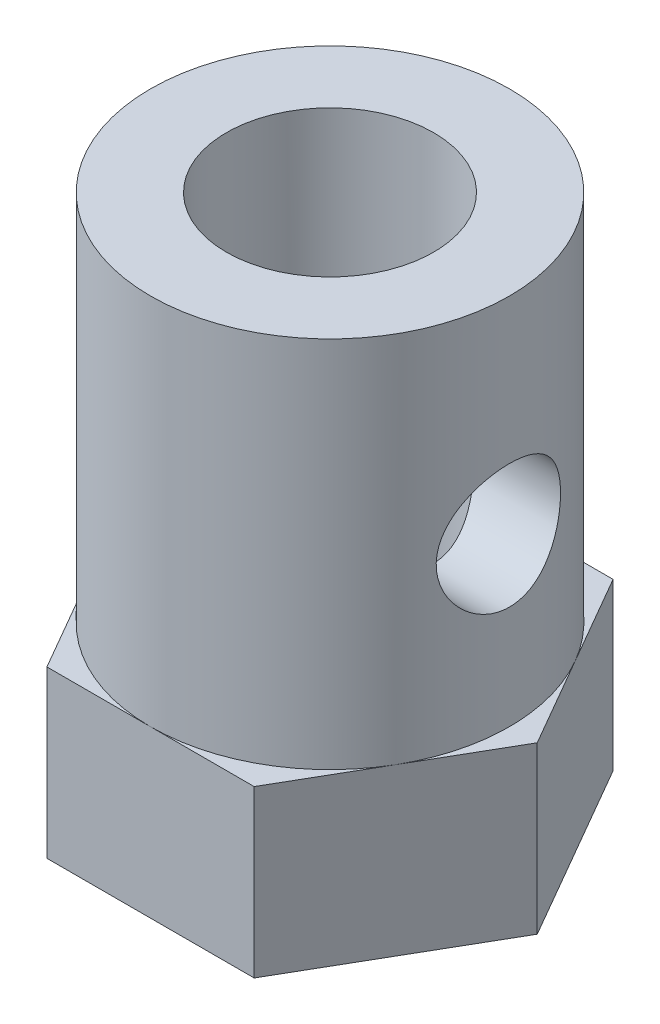
ISO-10303-21;
HEADER;
FILE_DESCRIPTION(('STEP AP214'),'2;1');
FILE_NAME('part.step','',(''),(''),'','','');
FILE_SCHEMA(('AUTOMOTIVE_DESIGN { 1 0 10303 214 1 1 1 1 }'));
ENDSEC;
DATA;
#1=APPLICATION_CONTEXT('core data for automotive mechanical design processes');
#2=APPLICATION_PROTOCOL_DEFINITION('international standard','automotive_design',2000,#1);
#3=PRODUCT_CONTEXT('',#1,'mechanical');
#4=PRODUCT('Part','Part','',(#3));
#5=PRODUCT_RELATED_PRODUCT_CATEGORY('part','',(#4));
#6=PRODUCT_DEFINITION_FORMATION('','',#4);
#7=PRODUCT_DEFINITION_CONTEXT('part definition',#1,'design');
#8=PRODUCT_DEFINITION('design','',#6,#7);
#9=PRODUCT_DEFINITION_SHAPE('','',#8);
#10=(LENGTH_UNIT() NAMED_UNIT(*) SI_UNIT(.MILLI.,.METRE.));
#11=(NAMED_UNIT(*) PLANE_ANGLE_UNIT() SI_UNIT($,.RADIAN.));
#12=(NAMED_UNIT(*) SI_UNIT($,.STERADIAN.) SOLID_ANGLE_UNIT());
#13=UNCERTAINTY_MEASURE_WITH_UNIT(LENGTH_MEASURE(1.E-05),#10,'distance_accuracy_value','');
#14=(GEOMETRIC_REPRESENTATION_CONTEXT(3) GLOBAL_UNCERTAINTY_ASSIGNED_CONTEXT((#13)) GLOBAL_UNIT_ASSIGNED_CONTEXT((#10,
#11,#12)) REPRESENTATION_CONTEXT('',''));
#15=CARTESIAN_POINT('',(0.,0.,0.));
#16=DIRECTION('',(0.,0.,1.));
#17=DIRECTION('',(1.,0.,0.));
#18=AXIS2_PLACEMENT_3D('',#15,#16,#17);
#19=CARTESIAN_POINT('',(0.,4.,0.));
#20=DIRECTION('',(0.,1.,0.));
#21=DIRECTION('',(0.,0.,1.));
#22=AXIS2_PLACEMENT_3D('',#19,#20,#21);
#23=PLANE('',#22);
#24=CARTESIAN_POINT('',(0.,4.,0.));
#25=DIRECTION('',(0.,1.,0.));
#26=DIRECTION('',(0.,0.,1.));
#27=AXIS2_PLACEMENT_3D('',#24,#25,#26);
#28=CIRCLE('',#27,4.33012701892221);
#29=CARTESIAN_POINT('',(0.,4.,4.33012701892221));
#30=VERTEX_POINT('',#29);
#31=CARTESIAN_POINT('',(3.75000000000001,4.,2.16506350946109));
#32=VERTEX_POINT('',#31);
#33=EDGE_CURVE('E58',#30,#32,#28,.T.);
#34=ORIENTED_EDGE('',*,*,#33,.F.);
#35=DIRECTION('',(1.,0.,0.));
#36=VECTOR('',#35,1.);
#37=CARTESIAN_POINT('',(0.,4.,4.3301270189222));
#38=LINE('',#37,#36);
#39=CARTESIAN_POINT('',(2.50000000000001,4.,4.3301270189222));
#40=VERTEX_POINT('',#39);
#41=EDGE_CURVE('E129',#30,#40,#38,.T.);
#42=ORIENTED_EDGE('',*,*,#41,.T.);
#43=DIRECTION('',(0.499999999999998,0.,-0.86602540378444));
#44=VECTOR('',#43,1.);
#45=CARTESIAN_POINT('',(3.75000000000001,4.,2.16506350946109));
#46=LINE('',#45,#44);
#47=EDGE_CURVE('E140',#40,#32,#46,.T.);
#48=ORIENTED_EDGE('',*,*,#47,.T.);
#49=EDGE_LOOP('',(#34,#42,#48));
#50=FACE_BOUND('',#49,.T.);
#51=ADVANCED_FACE('F41',(#50),#23,.T.);
#52=CARTESIAN_POINT('',(3.75,4.,-2.1650635094611));
#53=VERTEX_POINT('',#52);
#54=EDGE_CURVE('E11',#32,#53,#28,.T.);
#55=ORIENTED_EDGE('',*,*,#54,.F.);
#56=CARTESIAN_POINT('',(5.,4.,0.));
#57=VERTEX_POINT('',#56);
#58=EDGE_CURVE('E161',#32,#57,#46,.T.);
#59=ORIENTED_EDGE('',*,*,#58,.T.);
#60=DIRECTION('',(-0.5,0.,-0.866025403784439));
#61=VECTOR('',#60,1.);
#62=CARTESIAN_POINT('',(3.75,4.,-2.1650635094611));
#63=LINE('',#62,#61);
#64=EDGE_CURVE('E162',#57,#53,#63,.T.);
#65=ORIENTED_EDGE('',*,*,#64,.T.);
#66=EDGE_LOOP('',(#55,#59,#65));
#67=FACE_BOUND('',#66,.T.);
#68=ADVANCED_FACE('F288',(#67),#23,.T.);
#69=CARTESIAN_POINT('',(0.,4.,-4.33012701892219));
#70=VERTEX_POINT('',#69);
#71=EDGE_CURVE('E56',#53,#70,#28,.T.);
#72=ORIENTED_EDGE('',*,*,#71,.F.);
#73=CARTESIAN_POINT('',(2.5,4.,-4.33012701892219));
#74=VERTEX_POINT('',#73);
#75=EDGE_CURVE('E160',#53,#74,#63,.T.);
#76=ORIENTED_EDGE('',*,*,#75,.T.);
#77=DIRECTION('',(-1.,0.,0.));
#78=VECTOR('',#77,1.);
#79=CARTESIAN_POINT('',(0.,4.,-4.33012701892219));
#80=LINE('',#79,#78);
#81=EDGE_CURVE('E167',#74,#70,#80,.T.);
#82=ORIENTED_EDGE('',*,*,#81,.T.);
#83=EDGE_LOOP('',(#72,#76,#82));
#84=FACE_BOUND('',#83,.T.);
#85=ADVANCED_FACE('F292',(#84),#23,.T.);
#86=CARTESIAN_POINT('',(-3.75,4.,-2.1650635094611));
#87=VERTEX_POINT('',#86);
#88=EDGE_CURVE('E151',#70,#87,#28,.T.);
#89=ORIENTED_EDGE('',*,*,#88,.F.);
#90=CARTESIAN_POINT('',(-2.5,4.,-4.33012701892219));
#91=VERTEX_POINT('',#90);
#92=EDGE_CURVE('E166',#70,#91,#80,.T.);
#93=ORIENTED_EDGE('',*,*,#92,.T.);
#94=DIRECTION('',(-0.5,0.,0.866025403784439));
#95=VECTOR('',#94,1.);
#96=CARTESIAN_POINT('',(-3.75,4.,-2.1650635094611));
#97=LINE('',#96,#95);
#98=EDGE_CURVE('E172',#91,#87,#97,.T.);
#99=ORIENTED_EDGE('',*,*,#98,.T.);
#100=EDGE_LOOP('',(#89,#93,#99));
#101=FACE_BOUND('',#100,.T.);
#102=ADVANCED_FACE('F297',(#101),#23,.T.);
#103=CARTESIAN_POINT('',(-3.75,4.,2.1650635094611));
#104=VERTEX_POINT('',#103);
#105=EDGE_CURVE('E72',#87,#104,#28,.T.);
#106=ORIENTED_EDGE('',*,*,#105,.F.);
#107=CARTESIAN_POINT('',(-5.,4.,0.));
#108=VERTEX_POINT('',#107);
#109=EDGE_CURVE('E171',#87,#108,#97,.T.);
#110=ORIENTED_EDGE('',*,*,#109,.T.);
#111=DIRECTION('',(-0.500000000000001,0.,-0.866025403784438));
#112=VECTOR('',#111,1.);
#113=CARTESIAN_POINT('',(-3.75,4.,2.1650635094611));
#114=LINE('',#113,#112);
#115=EDGE_CURVE('E176',#104,#108,#114,.T.);
#116=ORIENTED_EDGE('',*,*,#115,.F.);
#117=EDGE_LOOP('',(#106,#110,#116));
#118=FACE_BOUND('',#117,.T.);
#119=ADVANCED_FACE('F285',(#118),#23,.T.);
#120=CARTESIAN_POINT('',(3.75000000000001,4.,2.16506350946109));
#121=DIRECTION('',(-0.86602540378444,0.,-0.499999999999998));
#122=DIRECTION('',(-0.499999999999998,0.,0.86602540378444));
#123=AXIS2_PLACEMENT_3D('',#120,#121,#122);
#124=PLANE('',#123);
#125=DIRECTION('',(0.499999999999998,0.,-0.86602540378444));
#126=VECTOR('',#125,1.);
#127=CARTESIAN_POINT('',(3.75000000000001,0.,2.16506350946109));
#128=LINE('',#127,#126);
#129=CARTESIAN_POINT('',(2.50000000000001,0.,4.3301270189222));
#130=VERTEX_POINT('',#129);
#131=CARTESIAN_POINT('',(5.,0.,0.));
#132=VERTEX_POINT('',#131);
#133=EDGE_CURVE('E179',#130,#132,#128,.T.);
#134=ORIENTED_EDGE('',*,*,#133,.T.);
#135=DIRECTION('',(0.,-1.,0.));
#136=VECTOR('',#135,1.);
#137=CARTESIAN_POINT('',(5.,4.,0.));
#138=LINE('',#137,#136);
#139=EDGE_CURVE('E148',#57,#132,#138,.T.);
#140=ORIENTED_EDGE('',*,*,#139,.F.);
#141=ORIENTED_EDGE('',*,*,#58,.F.);
#142=ORIENTED_EDGE('',*,*,#47,.F.);
#143=DIRECTION('',(0.,-1.,0.));
#144=VECTOR('',#143,1.);
#145=CARTESIAN_POINT('',(2.50000000000001,4.,4.3301270189222));
#146=LINE('',#145,#144);
#147=EDGE_CURVE('E128',#40,#130,#146,.T.);
#148=ORIENTED_EDGE('',*,*,#147,.T.);
#149=EDGE_LOOP('',(#134,#140,#141,#142,#148));
#150=FACE_BOUND('',#149,.T.);
#151=ADVANCED_FACE('F43',(#150),#124,.F.);
#152=CARTESIAN_POINT('',(3.75,4.,-2.1650635094611));
#153=DIRECTION('',(-0.866025403784439,0.,0.5));
#154=DIRECTION('',(0.5,0.,0.866025403784439));
#155=AXIS2_PLACEMENT_3D('',#152,#153,#154);
#156=PLANE('',#155);
#157=DIRECTION('',(-0.5,0.,-0.866025403784439));
#158=VECTOR('',#157,1.);
#159=CARTESIAN_POINT('',(3.75,0.,-2.1650635094611));
#160=LINE('',#159,#158);
#161=CARTESIAN_POINT('',(2.5,0.,-4.33012701892219));
#162=VERTEX_POINT('',#161);
#163=EDGE_CURVE('E183',#132,#162,#160,.T.);
#164=ORIENTED_EDGE('',*,*,#163,.T.);
#165=DIRECTION('',(0.,-1.,0.));
#166=VECTOR('',#165,1.);
#167=CARTESIAN_POINT('',(2.5,4.,-4.33012701892219));
#168=LINE('',#167,#166);
#169=EDGE_CURVE('E153',#74,#162,#168,.T.);
#170=ORIENTED_EDGE('',*,*,#169,.F.);
#171=ORIENTED_EDGE('',*,*,#75,.F.);
#172=ORIENTED_EDGE('',*,*,#64,.F.);
#173=ORIENTED_EDGE('',*,*,#139,.T.);
#174=EDGE_LOOP('',(#164,#170,#171,#172,#173));
#175=FACE_BOUND('',#174,.T.);
#176=ADVANCED_FACE('F278',(#175),#156,.F.);
#177=CARTESIAN_POINT('',(0.,4.,-4.33012701892219));
#178=DIRECTION('',(0.,0.,1.));
#179=DIRECTION('',(1.,0.,0.));
#180=AXIS2_PLACEMENT_3D('',#177,#178,#179);
#181=PLANE('',#180);
#182=DIRECTION('',(-1.,0.,0.));
#183=VECTOR('',#182,1.);
#184=CARTESIAN_POINT('',(0.,0.,-4.33012701892219));
#185=LINE('',#184,#183);
#186=CARTESIAN_POINT('',(-2.5,0.,-4.33012701892219));
#187=VERTEX_POINT('',#186);
#188=EDGE_CURVE('E186',#162,#187,#185,.T.);
#189=ORIENTED_EDGE('',*,*,#188,.T.);
#190=DIRECTION('',(0.,-1.,0.));
#191=VECTOR('',#190,1.);
#192=CARTESIAN_POINT('',(-2.5,4.,-4.33012701892219));
#193=LINE('',#192,#191);
#194=EDGE_CURVE('E208',#91,#187,#193,.T.);
#195=ORIENTED_EDGE('',*,*,#194,.F.);
#196=ORIENTED_EDGE('',*,*,#92,.F.);
#197=ORIENTED_EDGE('',*,*,#81,.F.);
#198=ORIENTED_EDGE('',*,*,#169,.T.);
#199=EDGE_LOOP('',(#189,#195,#196,#197,#198));
#200=FACE_BOUND('',#199,.T.);
#201=ADVANCED_FACE('F275',(#200),#181,.F.);
#202=CARTESIAN_POINT('',(-3.75,4.,-2.1650635094611));
#203=DIRECTION('',(0.866025403784439,0.,0.5));
#204=DIRECTION('',(0.5,0.,-0.866025403784439));
#205=AXIS2_PLACEMENT_3D('',#202,#203,#204);
#206=PLANE('',#205);
#207=DIRECTION('',(-0.5,0.,0.866025403784439));
#208=VECTOR('',#207,1.);
#209=CARTESIAN_POINT('',(-3.75,0.,-2.1650635094611));
#210=LINE('',#209,#208);
#211=CARTESIAN_POINT('',(-5.,0.,0.));
#212=VERTEX_POINT('',#211);
#213=EDGE_CURVE('E189',#187,#212,#210,.T.);
#214=ORIENTED_EDGE('',*,*,#213,.T.);
#215=DIRECTION('',(0.,-1.,0.));
#216=VECTOR('',#215,1.);
#217=CARTESIAN_POINT('',(-5.,4.,0.));
#218=LINE('',#217,#216);
#219=EDGE_CURVE('E205',#108,#212,#218,.T.);
#220=ORIENTED_EDGE('',*,*,#219,.F.);
#221=ORIENTED_EDGE('',*,*,#109,.F.);
#222=ORIENTED_EDGE('',*,*,#98,.F.);
#223=ORIENTED_EDGE('',*,*,#194,.T.);
#224=EDGE_LOOP('',(#214,#220,#221,#222,#223));
#225=FACE_BOUND('',#224,.T.);
#226=ADVANCED_FACE('F271',(#225),#206,.F.);
#227=CARTESIAN_POINT('',(-3.75,4.,2.1650635094611));
#228=DIRECTION('',(-0.866025403784438,0.,0.500000000000001));
#229=DIRECTION('',(0.500000000000001,0.,0.866025403784438));
#230=AXIS2_PLACEMENT_3D('',#227,#228,#229);
#231=PLANE('',#230);
#232=DIRECTION('',(-0.500000000000001,0.,-0.866025403784438));
#233=VECTOR('',#232,1.);
#234=CARTESIAN_POINT('',(-3.75,0.,2.1650635094611));
#235=LINE('',#234,#233);
#236=CARTESIAN_POINT('',(-2.49999999999999,0.,4.3301270189222));
#237=VERTEX_POINT('',#236);
#238=EDGE_CURVE('E193',#237,#212,#235,.T.);
#239=ORIENTED_EDGE('',*,*,#238,.F.);
#240=DIRECTION('',(0.,-1.,0.));
#241=VECTOR('',#240,1.);
#242=CARTESIAN_POINT('',(-2.49999999999999,4.,4.3301270189222));
#243=LINE('',#242,#241);
#244=CARTESIAN_POINT('',(-2.49999999999999,4.,4.3301270189222));
#245=VERTEX_POINT('',#244);
#246=EDGE_CURVE('E202',#245,#237,#243,.T.);
#247=ORIENTED_EDGE('',*,*,#246,.F.);
#248=EDGE_CURVE('E125',#245,#104,#114,.T.);
#249=ORIENTED_EDGE('',*,*,#248,.T.);
#250=ORIENTED_EDGE('',*,*,#115,.T.);
#251=ORIENTED_EDGE('',*,*,#219,.T.);
#252=EDGE_LOOP('',(#239,#247,#249,#250,#251));
#253=FACE_BOUND('',#252,.T.);
#254=ADVANCED_FACE('F268',(#253),#231,.T.);
#255=CARTESIAN_POINT('',(0.,4.,4.3301270189222));
#256=DIRECTION('',(0.,0.,-1.));
#257=DIRECTION('',(-1.,0.,0.));
#258=AXIS2_PLACEMENT_3D('',#255,#256,#257);
#259=PLANE('',#258);
#260=DIRECTION('',(1.,0.,0.));
#261=VECTOR('',#260,1.);
#262=CARTESIAN_POINT('',(0.,0.,4.3301270189222));
#263=LINE('',#262,#261);
#264=EDGE_CURVE('E197',#237,#130,#263,.T.);
#265=ORIENTED_EDGE('',*,*,#264,.T.);
#266=ORIENTED_EDGE('',*,*,#147,.F.);
#267=ORIENTED_EDGE('',*,*,#41,.F.);
#268=EDGE_CURVE('E121',#245,#30,#38,.T.);
#269=ORIENTED_EDGE('',*,*,#268,.F.);
#270=ORIENTED_EDGE('',*,*,#246,.T.);
#271=EDGE_LOOP('',(#265,#266,#267,#269,#270));
#272=FACE_BOUND('',#271,.T.);
#273=ADVANCED_FACE('F133',(#272),#259,.F.);
#274=EDGE_CURVE('E65',#104,#30,#28,.T.);
#275=ORIENTED_EDGE('',*,*,#274,.F.);
#276=ORIENTED_EDGE('',*,*,#248,.F.);
#277=ORIENTED_EDGE('',*,*,#268,.T.);
#278=EDGE_LOOP('',(#275,#276,#277));
#279=FACE_BOUND('',#278,.T.);
#280=ADVANCED_FACE('F123',(#279),#23,.T.);
#281=CARTESIAN_POINT('',(0.,0.,0.));
#282=DIRECTION('',(0.,1.,0.));
#283=DIRECTION('',(0.,0.,1.));
#284=AXIS2_PLACEMENT_3D('',#281,#282,#283);
#285=PLANE('',#284);
#286=CARTESIAN_POINT('',(0.,0.,0.));
#287=DIRECTION('',(0.,-1.,0.));
#288=DIRECTION('',(0.,0.,-1.));
#289=AXIS2_PLACEMENT_3D('',#286,#287,#288);
#290=CIRCLE('',#289,1.5);
#291=CARTESIAN_POINT('',(0.,0.,-1.5));
#292=VERTEX_POINT('',#291);
#293=EDGE_CURVE('E219',#292,#292,#290,.T.);
#294=ORIENTED_EDGE('',*,*,#293,.F.);
#295=EDGE_LOOP('',(#294));
#296=FACE_BOUND('',#295,.T.);
#297=ORIENTED_EDGE('',*,*,#133,.F.);
#298=ORIENTED_EDGE('',*,*,#264,.F.);
#299=ORIENTED_EDGE('',*,*,#238,.T.);
#300=ORIENTED_EDGE('',*,*,#213,.F.);
#301=ORIENTED_EDGE('',*,*,#188,.F.);
#302=ORIENTED_EDGE('',*,*,#163,.F.);
#303=EDGE_LOOP('',(#297,#298,#299,#300,#301,#302));
#304=FACE_BOUND('',#303,.T.);
#305=ADVANCED_FACE('F261',(#296,#304),#285,.F.);
#306=CARTESIAN_POINT('',(0.,13.,0.));
#307=DIRECTION('',(0.,1.,0.));
#308=DIRECTION('',(0.,0.,1.));
#309=AXIS2_PLACEMENT_3D('',#306,#307,#308);
#310=PLANE('',#309);
#311=CARTESIAN_POINT('',(0.,13.,0.));
#312=DIRECTION('',(0.,1.,0.));
#313=DIRECTION('',(0.,0.,1.));
#314=AXIS2_PLACEMENT_3D('',#311,#312,#313);
#315=CIRCLE('',#314,4.33012701892221);
#316=CARTESIAN_POINT('',(0.,13.,4.33012701892221));
#317=VERTEX_POINT('',#316);
#318=EDGE_CURVE('E143',#317,#317,#315,.T.);
#319=ORIENTED_EDGE('',*,*,#318,.T.);
#320=EDGE_LOOP('',(#319));
#321=FACE_BOUND('',#320,.T.);
#322=CARTESIAN_POINT('',(0.,13.,0.));
#323=DIRECTION('',(0.,1.,0.));
#324=DIRECTION('',(0.,0.,1.));
#325=AXIS2_PLACEMENT_3D('',#322,#323,#324);
#326=CIRCLE('',#325,2.5);
#327=CARTESIAN_POINT('',(0.,13.,2.5));
#328=VERTEX_POINT('',#327);
#329=EDGE_CURVE('E144',#328,#328,#326,.T.);
#330=ORIENTED_EDGE('',*,*,#329,.F.);
#331=EDGE_LOOP('',(#330));
#332=FACE_BOUND('',#331,.T.);
#333=ADVANCED_FACE('F256',(#321,#332),#310,.T.);
#334=CARTESIAN_POINT('',(0.,13.,0.));
#335=DIRECTION('',(0.,-1.,0.));
#336=DIRECTION('',(0.,0.,-1.));
#337=AXIS2_PLACEMENT_3D('',#334,#335,#336);
#338=CYLINDRICAL_SURFACE('',#337,4.33012701892221);
#339=CARTESIAN_POINT('',(-4.06201920231799,8.,-1.5));
#340=CARTESIAN_POINT('',(-4.06201829297026,8.0814938424258,-1.5000010969207));
#341=CARTESIAN_POINT('',(-4.06449840865839,8.16298005747054,-1.4933363924465));
#342=CARTESIAN_POINT('',(-4.07409406408563,8.32352527491749,-1.46695287750996));
#343=CARTESIAN_POINT('',(-4.0812100690081,8.40258403290539,-1.44723275701257));
#344=CARTESIAN_POINT('',(-4.09917682253857,8.5559198400406,-1.3955247668456));
#345=CARTESIAN_POINT('',(-4.11001976715487,8.63020649894368,-1.36356251561218));
#346=CARTESIAN_POINT('',(-4.13420696218894,8.77238908350442,-1.28836614745793));
#347=CARTESIAN_POINT('',(-4.14755183061625,8.84028342393375,-1.24512924450968));
#348=CARTESIAN_POINT('',(-4.17587211231074,8.97062582726069,-1.14665191787395));
#349=CARTESIAN_POINT('',(-4.19089047294606,9.03276442298253,-1.09101413863853));
#350=CARTESIAN_POINT('',(-4.2205040199965,9.14704229275988,-0.970160934592438));
#351=CARTESIAN_POINT('',(-4.23509913177446,9.19917981218374,-0.904943832681863));
#352=CARTESIAN_POINT('',(-4.26272293472554,9.29340554079394,-0.764494300228949));
#353=CARTESIAN_POINT('',(-4.27569528279132,9.33516583627581,-0.689029812235445));
#354=CARTESIAN_POINT('',(-4.29810285001056,9.40527471530761,-0.531619845384658));
#355=CARTESIAN_POINT('',(-4.30753910377853,9.43362722243636,-0.449676270733444));
#356=CARTESIAN_POINT('',(-4.32150688390927,9.47505549170988,-0.284881641485258));
#357=CARTESIAN_POINT('',(-4.32620840655388,9.48866218919827,-0.202178741682391));
#358=CARTESIAN_POINT('',(-4.33078243048289,9.50190470535978,-0.0355388462321692));
#359=CARTESIAN_POINT('',(-4.33065627390172,9.50154440697191,0.0483977999370216));
#360=CARTESIAN_POINT('',(-4.32570223413052,9.48719162768811,0.211350265431297));
#361=CARTESIAN_POINT('',(-4.32107353241669,9.47377664359851,0.290424015070711));
#362=CARTESIAN_POINT('',(-4.30788793658276,9.43465524190069,0.445119299538504));
#363=CARTESIAN_POINT('',(-4.29933077137634,9.40894797605002,0.520740595731968));
#364=CARTESIAN_POINT('',(-4.27900492525008,9.34565606079292,0.667601875613942));
#365=CARTESIAN_POINT('',(-4.26719400308694,9.30791408077403,0.738767967800968));
#366=CARTESIAN_POINT('',(-4.24157985861932,9.22175637750356,0.873921517182247));
#367=CARTESIAN_POINT('',(-4.22777605287054,9.17333752625299,0.937906862329105));
#368=CARTESIAN_POINT('',(-4.1987974362805,9.06432801025522,1.06030963761961));
#369=CARTESIAN_POINT('',(-4.18358859500848,9.0032455018529,1.11828163891209));
#370=CARTESIAN_POINT('',(-4.154093632098,8.87210644320814,1.22331078561084));
#371=CARTESIAN_POINT('',(-4.13980767768471,8.80204827341702,1.27036595689056));
#372=CARTESIAN_POINT('',(-4.11358084408205,8.65343211189107,1.35291036458681));
#373=CARTESIAN_POINT('',(-4.10168248733034,8.57475307973671,1.388196234834));
#374=CARTESIAN_POINT('',(-4.08206876612466,8.41205215289713,1.44486137842434));
#375=CARTESIAN_POINT('',(-4.07435147907949,8.32803273378744,1.46624704443639));
#376=CARTESIAN_POINT('',(-4.06441422274515,8.16137927493965,1.49356599443671));
#377=CARTESIAN_POINT('',(-4.06194690108254,8.07887409655317,1.50019527467396));
#378=CARTESIAN_POINT('',(-4.06209470725096,7.91391093402318,1.49979604955376));
#379=CARTESIAN_POINT('',(-4.06470881456575,7.83145294372957,1.49277028657328));
#380=CARTESIAN_POINT('',(-4.07447687879738,7.67220818770743,1.46588771883357));
#381=CARTESIAN_POINT('',(-4.08145393156267,7.59532506347819,1.44653037373517));
#382=CARTESIAN_POINT('',(-4.09896249797368,7.4459189947872,1.39614214438821));
#383=CARTESIAN_POINT('',(-4.10949467272956,7.3733968642528,1.36510908880251));
#384=CARTESIAN_POINT('',(-4.13336399703954,7.23206923044922,1.29106903068387));
#385=CARTESIAN_POINT('',(-4.14678347725179,7.16347037359041,1.2476948616305));
#386=CARTESIAN_POINT('',(-4.17476231286136,7.03427427771937,1.15061197040125));
#387=CARTESIAN_POINT('',(-4.18932202889422,6.97367958669022,1.0968999706671));
#388=CARTESIAN_POINT('',(-4.21886736668732,6.85891240660394,0.97731320777912));
#389=CARTESIAN_POINT('',(-4.23383508291716,6.80524566480929,0.910947144721933));
#390=CARTESIAN_POINT('',(-4.26176083046736,6.70976944128134,0.769781886735604));
#391=CARTESIAN_POINT('',(-4.27471891446709,6.66795964871277,0.694982912950887));
#392=CARTESIAN_POINT('',(-4.29711743032177,6.59774367512578,0.539367919335131));
#393=CARTESIAN_POINT('',(-4.30657818192505,6.5692598042304,0.458590038016914));
#394=CARTESIAN_POINT('',(-4.32100087895192,6.52641231384476,0.292994660825742));
#395=CARTESIAN_POINT('',(-4.32596459368908,6.51204314088214,0.208178767504132));
#396=CARTESIAN_POINT('',(-4.33068989813883,6.49836368234432,0.0415232226315432));
#397=CARTESIAN_POINT('',(-4.33070142028574,6.49832990421046,-0.0402505654856424));
#398=CARTESIAN_POINT('',(-4.32614737415787,6.51151440591161,-0.202584667856792));
#399=CARTESIAN_POINT('',(-4.3215822285339,6.524731462045,-0.283145093466295));
#400=CARTESIAN_POINT('',(-4.30848682915845,6.56355216977881,-0.439288202327729));
#401=CARTESIAN_POINT('',(-4.30003064101723,6.58892479732331,-0.514934987256142));
#402=CARTESIAN_POINT('',(-4.28002546963459,6.65111816311591,-0.660920931215788));
#403=CARTESIAN_POINT('',(-4.26847591421886,6.68794101949426,-0.731259105234981));
#404=CARTESIAN_POINT('',(-4.24290735901062,6.77362493563828,-0.867603609054626));
#405=CARTESIAN_POINT('',(-4.22881007711121,6.82289679616995,-0.933336875602499));
#406=CARTESIAN_POINT('',(-4.19990242885399,6.93139741146564,-1.05583518751176));
#407=CARTESIAN_POINT('',(-4.18509182713578,6.99062946888812,-1.11259724599848));
#408=CARTESIAN_POINT('',(-4.15565826253216,7.12042411372763,-1.21804509336781));
#409=CARTESIAN_POINT('',(-4.14107105606212,7.19136568233008,-1.26627596483531));
#410=CARTESIAN_POINT('',(-4.11450385567476,7.34080696895577,-1.35011140623119));
#411=CARTESIAN_POINT('',(-4.10252344661271,7.41930548062393,-1.38571798720652));
#412=CARTESIAN_POINT('',(-4.08288756790529,7.58021657601065,-1.44254058596592));
#413=CARTESIAN_POINT('',(-4.07515581492669,7.66252922847341,-1.4640118965638));
#414=CARTESIAN_POINT('',(-4.0647231744084,7.82989814310732,-1.49273801378515));
#415=CARTESIAN_POINT('',(-4.06202015131107,7.91495322502824,-1.49999885525624));
#416=CARTESIAN_POINT('',(-4.06201920231799,8.,-1.5));
#417=B_SPLINE_CURVE_WITH_KNOTS('',3,(#339,#340,#341,#342,#343,#344,#345,#346,#347,#348,#349,
#350,#351,#352,#353,#354,#355,#356,#357,#358,#359,#360,#361,#362,#363,#364,#365,#366,#367,#368,
#369,#370,#371,#372,#373,#374,#375,#376,#377,#378,#379,#380,#381,#382,#383,#384,#385,#386,#387,
#388,#389,#390,#391,#392,#393,#394,#395,#396,#397,#398,#399,#400,#401,#402,#403,#404,#405,#406,
#407,#408,#409,#410,#411,#412,#413,#414,#415,#416),.UNSPECIFIED.,.T.,.F.,(4,2,2,2,2,2,2,2,2,2,2,
2,2,2,2,2,2,2,2,2,2,2,2,2,2,2,2,2,2,2,2,2,2,2,2,2,2,2,4),(0.,0.244166052125747,
0.488356608608755,0.732038928399893,0.97578152056581,1.22888876258823,1.48204037029548,
1.74239045711719,2.00266430935436,2.25321888533328,2.50370380559198,2.74358934887054,
2.98349144810456,3.22666808582024,3.46991606178296,3.72546969549231,3.98106950585429,
4.24088120804945,4.50057333879472,4.74773132879353,4.99483968655531,5.23252585249787,
5.47025624291032,5.71597141706229,5.96176462270885,6.22049209118132,6.4792127763691,
6.73640572758518,6.99349744484334,7.23761238346528,7.48170478038726,7.72133174492158,
7.96100306344934,8.20995152762215,8.45898270290191,8.71877376966474,8.97852343314901,
9.23344281066207,9.48825390647939),.UNSPECIFIED.);
#418=CARTESIAN_POINT('',(-4.06201920231799,8.,-1.5));
#419=VERTEX_POINT('',#418);
#420=EDGE_CURVE('E248',#419,#419,#417,.T.);
#421=ORIENTED_EDGE('',*,*,#420,.T.);
#422=EDGE_LOOP('',(#421));
#423=FACE_BOUND('',#422,.T.);
#424=CARTESIAN_POINT('',(4.06201920231799,8.,-1.5));
#425=CARTESIAN_POINT('',(4.06201829297026,7.9185061575742,-1.5000010969207));
#426=CARTESIAN_POINT('',(4.06449840865839,7.83701994252946,-1.4933363924465));
#427=CARTESIAN_POINT('',(4.07409406408563,7.67647472508251,-1.46695287750996));
#428=CARTESIAN_POINT('',(4.0812100690081,7.59741596709461,-1.44723275701257));
#429=CARTESIAN_POINT('',(4.09917682253857,7.4440801599594,-1.3955247668456));
#430=CARTESIAN_POINT('',(4.11001976715487,7.36979350105632,-1.36356251561218));
#431=CARTESIAN_POINT('',(4.13420696218894,7.22761091649558,-1.28836614745793));
#432=CARTESIAN_POINT('',(4.14755183061625,7.15971657606625,-1.24512924450968));
#433=CARTESIAN_POINT('',(4.17587211231074,7.02937417273931,-1.14665191787395));
#434=CARTESIAN_POINT('',(4.19089047294606,6.96723557701747,-1.09101413863853));
#435=CARTESIAN_POINT('',(4.2205040199965,6.85295770724011,-0.970160934592437));
#436=CARTESIAN_POINT('',(4.23509913177446,6.80082018781626,-0.904943832681861));
#437=CARTESIAN_POINT('',(4.26272293472554,6.70659445920606,-0.764494300228947));
#438=CARTESIAN_POINT('',(4.27569528279132,6.66483416372418,-0.689029812235444));
#439=CARTESIAN_POINT('',(4.29810285001056,6.59472528469238,-0.531619845384657));
#440=CARTESIAN_POINT('',(4.30753910377853,6.56637277756364,-0.449676270733442));
#441=CARTESIAN_POINT('',(4.32150688390927,6.52494450829012,-0.284881641485257));
#442=CARTESIAN_POINT('',(4.32620840655388,6.51133781080173,-0.20217874168239));
#443=CARTESIAN_POINT('',(4.33078243048289,6.49809529464022,-0.0355388462321678));
#444=CARTESIAN_POINT('',(4.33065627390172,6.49845559302809,0.0483977999370228));
#445=CARTESIAN_POINT('',(4.32570223413052,6.51280837231189,0.211350265431298));
#446=CARTESIAN_POINT('',(4.32107353241669,6.52622335640149,0.290424015070712));
#447=CARTESIAN_POINT('',(4.30788793658276,6.56534475809931,0.445119299538506));
#448=CARTESIAN_POINT('',(4.29933077137634,6.59105202394998,0.520740595731969));
#449=CARTESIAN_POINT('',(4.27900492525008,6.65434393920708,0.667601875613943));
#450=CARTESIAN_POINT('',(4.26719400308694,6.69208591922597,0.738767967800969));
#451=CARTESIAN_POINT('',(4.24157985861933,6.77824362249644,0.873921517182249));
#452=CARTESIAN_POINT('',(4.22777605287054,6.82666247374702,0.937906862329107));
#453=CARTESIAN_POINT('',(4.1987974362805,6.93567198974478,1.06030963761962));
#454=CARTESIAN_POINT('',(4.18358859500848,6.99675449814711,1.11828163891209));
#455=CARTESIAN_POINT('',(4.154093632098,7.12789355679186,1.22331078561084));
#456=CARTESIAN_POINT('',(4.13980767768471,7.19795172658298,1.27036595689056));
#457=CARTESIAN_POINT('',(4.11358084408205,7.34656788810893,1.35291036458681));
#458=CARTESIAN_POINT('',(4.10168248733034,7.42524692026329,1.388196234834));
#459=CARTESIAN_POINT('',(4.08206876612466,7.58794784710287,1.44486137842434));
#460=CARTESIAN_POINT('',(4.07435147907949,7.67196726621256,1.46624704443639));
#461=CARTESIAN_POINT('',(4.06441422274515,7.83862072506035,1.49356599443671));
#462=CARTESIAN_POINT('',(4.06194690108254,7.92112590344683,1.50019527467396));
#463=CARTESIAN_POINT('',(4.06209470725096,8.08608906597682,1.49979604955376));
#464=CARTESIAN_POINT('',(4.06470881456575,8.16854705627043,1.49277028657328));
#465=CARTESIAN_POINT('',(4.07447687879738,8.32779181229257,1.46588771883357));
#466=CARTESIAN_POINT('',(4.08145393156267,8.40467493652181,1.44653037373517));
#467=CARTESIAN_POINT('',(4.09896249797368,8.55408100521281,1.39614214438821));
#468=CARTESIAN_POINT('',(4.10949467272956,8.62660313574721,1.36510908880251));
#469=CARTESIAN_POINT('',(4.13336399703954,8.76793076955078,1.29106903068386));
#470=CARTESIAN_POINT('',(4.14678347725179,8.83652962640959,1.2476948616305));
#471=CARTESIAN_POINT('',(4.17476231286136,8.96572572228063,1.15061197040125));
#472=CARTESIAN_POINT('',(4.18932202889422,9.02632041330978,1.0968999706671));
#473=CARTESIAN_POINT('',(4.21886736668732,9.14108759339606,0.977313207779119));
#474=CARTESIAN_POINT('',(4.23383508291716,9.19475433519072,0.910947144721931));
#475=CARTESIAN_POINT('',(4.26176083046736,9.29023055871866,0.769781886735603));
#476=CARTESIAN_POINT('',(4.27471891446709,9.33204035128723,0.694982912950885));
#477=CARTESIAN_POINT('',(4.29711743032177,9.40225632487422,0.539367919335129));
#478=CARTESIAN_POINT('',(4.30657818192505,9.4307401957696,0.458590038016911));
#479=CARTESIAN_POINT('',(4.32100087895192,9.47358768615524,0.292994660825739));
#480=CARTESIAN_POINT('',(4.32596459368908,9.48795685911786,0.208178767504129));
#481=CARTESIAN_POINT('',(4.33068989813883,9.50163631765568,0.0415232226315402));
#482=CARTESIAN_POINT('',(4.33070142028574,9.50167009578954,-0.0402505654856453));
#483=CARTESIAN_POINT('',(4.32614737415787,9.48848559408839,-0.202584667856794));
#484=CARTESIAN_POINT('',(4.3215822285339,9.475268537955,-0.283145093466297));
#485=CARTESIAN_POINT('',(4.30848682915845,9.43644783022119,-0.439288202327731));
#486=CARTESIAN_POINT('',(4.30003064101723,9.41107520267669,-0.514934987256144));
#487=CARTESIAN_POINT('',(4.28002546963459,9.34888183688409,-0.660920931215791));
#488=CARTESIAN_POINT('',(4.26847591421886,9.31205898050574,-0.731259105234983));
#489=CARTESIAN_POINT('',(4.24290735901062,9.22637506436172,-0.867603609054627));
#490=CARTESIAN_POINT('',(4.22881007711121,9.17710320383005,-0.933336875602501));
#491=CARTESIAN_POINT('',(4.19990242885399,9.06860258853436,-1.05583518751176));
#492=CARTESIAN_POINT('',(4.18509182713578,9.00937053111188,-1.11259724599848));
#493=CARTESIAN_POINT('',(4.15565826253216,8.87957588627237,-1.21804509336781));
#494=CARTESIAN_POINT('',(4.14107105606212,8.80863431766992,-1.26627596483531));
#495=CARTESIAN_POINT('',(4.11450385567476,8.65919303104423,-1.3501114062312));
#496=CARTESIAN_POINT('',(4.10252344661271,8.58069451937607,-1.38571798720652));
#497=CARTESIAN_POINT('',(4.08288756790529,8.41978342398935,-1.44254058596592));
#498=CARTESIAN_POINT('',(4.07515581492669,8.33747077152659,-1.4640118965638));
#499=CARTESIAN_POINT('',(4.0647231744084,8.17010185689268,-1.49273801378515));
#500=CARTESIAN_POINT('',(4.06202015131107,8.08504677497176,-1.49999885525624));
#501=CARTESIAN_POINT('',(4.06201920231799,8.,-1.5));
#502=B_SPLINE_CURVE_WITH_KNOTS('',3,(#424,#425,#426,#427,#428,#429,#430,#431,#432,#433,#434,
#435,#436,#437,#438,#439,#440,#441,#442,#443,#444,#445,#446,#447,#448,#449,#450,#451,#452,#453,
#454,#455,#456,#457,#458,#459,#460,#461,#462,#463,#464,#465,#466,#467,#468,#469,#470,#471,#472,
#473,#474,#475,#476,#477,#478,#479,#480,#481,#482,#483,#484,#485,#486,#487,#488,#489,#490,#491,
#492,#493,#494,#495,#496,#497,#498,#499,#500,#501),.UNSPECIFIED.,.T.,.F.,(4,2,2,2,2,2,2,2,2,2,2,
2,2,2,2,2,2,2,2,2,2,2,2,2,2,2,2,2,2,2,2,2,2,2,2,2,2,2,4),(0.,0.244166052125748,
0.488356608608756,0.732038928399894,0.975781520565812,1.22888876258823,1.48204037029548,
1.74239045711719,2.00266430935437,2.25321888533328,2.50370380559198,2.74358934887054,
2.98349144810456,3.22666808582024,3.46991606178297,3.72546969549231,3.9810695058543,
4.24088120804945,4.50057333879473,4.74773132879353,4.99483968655532,5.23252585249787,
5.47025624291032,5.7159714170623,5.96176462270885,6.22049209118133,6.4792127763691,
6.73640572758518,6.99349744484334,7.23761238346529,7.48170478038726,7.72133174492158,
7.96100306344935,8.20995152762215,8.45898270290191,8.71877376966474,8.97852343314901,
9.23344281066207,9.48825390647939),.UNSPECIFIED.);
#503=CARTESIAN_POINT('',(4.06201920231799,8.,-1.5));
#504=VERTEX_POINT('',#503);
#505=EDGE_CURVE('E241',#504,#504,#502,.T.);
#506=ORIENTED_EDGE('',*,*,#505,.T.);
#507=EDGE_LOOP('',(#506));
#508=FACE_BOUND('',#507,.T.);
#509=ORIENTED_EDGE('',*,*,#318,.F.);
#510=EDGE_LOOP('',(#509));
#511=FACE_BOUND('',#510,.T.);
#512=ORIENTED_EDGE('',*,*,#33,.T.);
#513=ORIENTED_EDGE('',*,*,#54,.T.);
#514=ORIENTED_EDGE('',*,*,#71,.T.);
#515=ORIENTED_EDGE('',*,*,#88,.T.);
#516=ORIENTED_EDGE('',*,*,#105,.T.);
#517=ORIENTED_EDGE('',*,*,#274,.T.);
#518=EDGE_LOOP('',(#512,#513,#514,#515,#516,#517));
#519=FACE_BOUND('',#518,.T.);
#520=ADVANCED_FACE('F145',(#423,#508,#511,#519),#338,.T.);
#521=CARTESIAN_POINT('',(0.,13.,0.));
#522=DIRECTION('',(0.,-1.,0.));
#523=DIRECTION('',(0.,0.,-1.));
#524=AXIS2_PLACEMENT_3D('',#521,#522,#523);
#525=CYLINDRICAL_SURFACE('',#524,2.5);
#526=CARTESIAN_POINT('',(-2.,8.,-1.5));
#527=CARTESIAN_POINT('',(-1.99999416642511,8.07547897528964,-1.50000404108592));
#528=CARTESIAN_POINT('',(-2.00433633903481,8.1509384340798,-1.49426852824014));
#529=CARTESIAN_POINT('',(-2.02092590613883,8.29932390396221,-1.47174965152787));
#530=CARTESIAN_POINT('',(-2.03318155043097,8.3722471873851,-1.45495475788936));
#531=CARTESIAN_POINT('',(-2.0636233903473,8.51308364167728,-1.41143486335796));
#532=CARTESIAN_POINT('',(-2.08176666183119,8.58102883803527,-1.3847815450315));
#533=CARTESIAN_POINT('',(-2.12185904995836,8.71143745336792,-1.3225290928302));
#534=CARTESIAN_POINT('',(-2.14380930122416,8.77389922969514,-1.28692729054694));
#535=CARTESIAN_POINT('',(-2.19228594587542,8.89994901666408,-1.20271292747644));
#536=CARTESIAN_POINT('',(-2.21904371037662,8.96274095712394,-1.15304179435289));
#537=CARTESIAN_POINT('',(-2.2722622943106,9.07976476274175,-1.04426801309985));
#538=CARTESIAN_POINT('',(-2.29872287517103,9.1339901516708,-0.985158296729615));
#539=CARTESIAN_POINT('',(-2.35175567858734,9.23813380970969,-0.851442367411705));
#540=CARTESIAN_POINT('',(-2.37803133577818,9.28695446366975,-0.775851995162551));
#541=CARTESIAN_POINT('',(-2.42443786983179,9.37080972244443,-0.615654228271661));
#542=CARTESIAN_POINT('',(-2.44457437988735,9.40585697412271,-0.531055196626333));
#543=CARTESIAN_POINT('',(-2.4747098780044,9.45759592281265,-0.363771406742669));
#544=CARTESIAN_POINT('',(-2.4854930393917,9.4757203609673,-0.281674698130918));
#545=CARTESIAN_POINT('',(-2.49874939277545,9.49794280286312,-0.11497050938271));
#546=CARTESIAN_POINT('',(-2.50123038813307,9.50205397800005,-0.0303654624001555));
#547=CARTESIAN_POINT('',(-2.49783372711539,9.49638625265754,0.127637283737308));
#548=CARTESIAN_POINT('',(-2.49295437513726,9.48826647383069,0.201123832865632));
#549=CARTESIAN_POINT('',(-2.47707997553857,9.46152020435189,0.345464269151766));
#550=CARTESIAN_POINT('',(-2.46608447529309,9.44289293609284,0.416317961051199));
#551=CARTESIAN_POINT('',(-2.43884907201719,9.39583443729622,0.554056780469078));
#552=CARTESIAN_POINT('',(-2.42257910450824,9.367346938861,0.620916491037615));
#553=CARTESIAN_POINT('',(-2.38609637638748,9.30161538377446,0.748988660115609));
#554=CARTESIAN_POINT('',(-2.36588259201812,9.26436905294099,0.810199646208009));
#555=CARTESIAN_POINT('',(-2.32037925976363,9.17716090719555,0.933074267143197));
#556=CARTESIAN_POINT('',(-2.2947718295215,9.12621168826426,0.993918663198191));
#557=CARTESIAN_POINT('',(-2.24255554245601,9.01559588213983,1.10671465909274));
#558=CARTESIAN_POINT('',(-2.21594536703375,8.9559174965255,1.15865401308339));
#559=CARTESIAN_POINT('',(-2.16111075123946,8.82134659383645,1.25824837767417));
#560=CARTESIAN_POINT('',(-2.13305661385124,8.74549242346054,1.30470933188632));
#561=CARTESIAN_POINT('',(-2.08250879557267,8.58529376836339,1.38397217194232));
#562=CARTESIAN_POINT('',(-2.06000490298821,8.50096528387436,1.41679921962189));
#563=CARTESIAN_POINT('',(-2.02895865196731,8.34760636810465,1.46077497064842));
#564=CARTESIAN_POINT('',(-2.01833888618316,8.27995936770336,1.47527903312665));
#565=CARTESIAN_POINT('',(-2.00392150777558,8.14262638970052,1.49480872755284));
#566=CARTESIAN_POINT('',(-2.00011596115116,8.07294287951544,1.49984538302907));
#567=CARTESIAN_POINT('',(-1.99988914321323,7.9334483175643,1.50014781114183));
#568=CARTESIAN_POINT('',(-2.00347810223984,7.86363722278479,1.49540004697659));
#569=CARTESIAN_POINT('',(-2.01751520788652,7.72601265625145,1.47640290574941));
#570=CARTESIAN_POINT('',(-2.02796877613213,7.65820080775975,1.46214601830139));
#571=CARTESIAN_POINT('',(-2.054317683331,7.52628542052022,1.42488312618657));
#572=CARTESIAN_POINT('',(-2.07020622092812,7.46217736346777,1.40188805257362));
#573=CARTESIAN_POINT('',(-2.10571539417587,7.33852228426982,1.34796261057072));
#574=CARTESIAN_POINT('',(-2.12533743689999,7.278976993634,1.31702924888212));
#575=CARTESIAN_POINT('',(-2.17036819177737,7.15475991748776,1.24167439558512));
#576=CARTESIAN_POINT('',(-2.19618239397369,7.09109916490343,1.19582663060303));
#577=CARTESIAN_POINT('',(-2.2482175480362,6.97171451515054,1.09487395518701));
#578=CARTESIAN_POINT('',(-2.27443886711455,6.91599830783089,1.03976018672402));
#579=CARTESIAN_POINT('',(-2.32835625910913,6.80677599264957,0.913274837212769));
#580=CARTESIAN_POINT('',(-2.3558007587587,6.75449927339417,0.840721108780194));
#581=CARTESIAN_POINT('',(-2.40537639133459,6.66309722316335,0.686103100868023));
#582=CARTESIAN_POINT('',(-2.4275110444941,6.62396317215908,0.604045176134705));
#583=CARTESIAN_POINT('',(-2.46252280092775,6.56313179656864,0.438840232972141));
#584=CARTESIAN_POINT('',(-2.47595588067329,6.5403737722089,0.356205963651261));
#585=CARTESIAN_POINT('',(-2.494407389061,6.50928539715374,0.18738306389086));
#586=CARTESIAN_POINT('',(-2.49943534582737,6.50093870928238,0.101198571781971));
#587=CARTESIAN_POINT('',(-2.50040600461976,6.49932539141407,-0.0598120232009814));
#588=CARTESIAN_POINT('',(-2.49747057186327,6.50419666543697,-0.134620583589704));
#589=CARTESIAN_POINT('',(-2.48512948412096,6.52489382438161,-0.282148755978771));
#590=CARTESIAN_POINT('',(-2.47572375706639,6.5407198313216,-0.354868344701912));
#591=CARTESIAN_POINT('',(-2.45149427526962,6.58221957158378,-0.495145481978795));
#592=CARTESIAN_POINT('',(-2.43675966858906,6.60773159612924,-0.562767032608828));
#593=CARTESIAN_POINT('',(-2.40303337447155,6.66764059455475,-0.692781971999982));
#594=CARTESIAN_POINT('',(-2.38404073252268,6.7020395608596,-0.75517418419983));
#595=CARTESIAN_POINT('',(-2.34093432659381,6.78292519656875,-0.880263645295945));
#596=CARTESIAN_POINT('',(-2.31648844639149,6.83031870901686,-0.942258690439938));
#597=CARTESIAN_POINT('',(-2.26601907350661,6.93375303371772,-1.05789751536306));
#598=CARTESIAN_POINT('',(-2.23999385274509,6.9898034256079,-1.11153190956916));
#599=CARTESIAN_POINT('',(-2.18528165666205,7.1172855621777,-1.2159097535057));
#600=CARTESIAN_POINT('',(-2.15667566270901,7.1897664861655,-1.26542406663367));
#601=CARTESIAN_POINT('',(-2.10376464485145,7.34348485276654,-1.35156817210325));
#602=CARTESIAN_POINT('',(-2.07945738811052,7.42471771398141,-1.38820466322661));
#603=CARTESIAN_POINT('',(-2.0408000304796,7.5870642851372,-1.44437116535132));
#604=CARTESIAN_POINT('',(-2.02577665830138,7.66759523596124,-1.46509526060187));
#605=CARTESIAN_POINT('',(-2.00539032320036,7.83209739470368,-1.49289268240426));
#606=CARTESIAN_POINT('',(-2.00000648744643,7.91606076575871,-1.49999550595837));
#607=CARTESIAN_POINT('',(-2.,8.,-1.5));
#608=B_SPLINE_CURVE_WITH_KNOTS('',3,(#526,#527,#528,#529,#530,#531,#532,#533,#534,#535,#536,
#537,#538,#539,#540,#541,#542,#543,#544,#545,#546,#547,#548,#549,#550,#551,#552,#553,#554,#555,
#556,#557,#558,#559,#560,#561,#562,#563,#564,#565,#566,#567,#568,#569,#570,#571,#572,#573,#574,
#575,#576,#577,#578,#579,#580,#581,#582,#583,#584,#585,#586,#587,#588,#589,#590,#591,#592,#593,
#594,#595,#596,#597,#598,#599,#600,#601,#602,#603,#604,#605,#606,#607),.UNSPECIFIED.,.T.,.F.,(4,
2,2,2,2,2,2,2,2,2,2,2,2,2,2,2,2,2,2,2,2,2,2,2,2,2,2,2,2,2,2,2,2,2,2,2,2,2,2,2,4),(0.,
0.226085249493392,0.452406574330769,0.677113624991876,0.901887762215931,1.15414462390001,
1.40659128601843,1.68630157736223,1.9657544327122,2.21853330858497,2.47107452602766,
2.69230130543181,2.91354445887944,3.13607155036376,3.35865648368878,3.60782810055849,
3.85733966656908,4.13576671140276,4.41367760154768,4.62276298054683,4.83160475643976,
5.04073566011181,5.25003193304127,5.45906724365495,5.6681814915466,5.91499438482002,
6.16204457978454,6.44121828011588,6.72020638384847,6.97891479383337,7.23732973022726,
7.46129321849399,7.68525920139647,7.90563970188756,8.12606965394584,8.37042963549486,
8.61506198741954,8.89071695766603,9.16622832484805,9.41820120134354,9.66962780912277),.UNSPECIFIED.);
#609=CARTESIAN_POINT('',(-2.,8.,-1.5));
#610=VERTEX_POINT('',#609);
#611=EDGE_CURVE('E45',#610,#610,#608,.T.);
#612=ORIENTED_EDGE('',*,*,#611,.F.);
#613=EDGE_LOOP('',(#612));
#614=FACE_BOUND('',#613,.T.);
#615=CARTESIAN_POINT('',(2.,8.,-1.5));
#616=CARTESIAN_POINT('',(1.99999416642511,7.92452102471036,-1.50000404108592));
#617=CARTESIAN_POINT('',(2.00433633903481,7.8490615659202,-1.49426852824014));
#618=CARTESIAN_POINT('',(2.02092590613883,7.70067609603778,-1.47174965152787));
#619=CARTESIAN_POINT('',(2.03318155043097,7.6277528126149,-1.45495475788936));
#620=CARTESIAN_POINT('',(2.0636233903473,7.48691635832272,-1.41143486335796));
#621=CARTESIAN_POINT('',(2.08176666183119,7.41897116196473,-1.3847815450315));
#622=CARTESIAN_POINT('',(2.12185904995836,7.28856254663208,-1.32252909283019));
#623=CARTESIAN_POINT('',(2.14380930122416,7.22610077030486,-1.28692729054693));
#624=CARTESIAN_POINT('',(2.19228594587542,7.10005098333592,-1.20271292747644));
#625=CARTESIAN_POINT('',(2.21904371037662,7.03725904287606,-1.15304179435289));
#626=CARTESIAN_POINT('',(2.27226229431061,6.92023523725825,-1.04426801309985));
#627=CARTESIAN_POINT('',(2.29872287517103,6.8660098483292,-0.985158296729613));
#628=CARTESIAN_POINT('',(2.35175567858734,6.7618661902903,-0.851442367411702));
#629=CARTESIAN_POINT('',(2.37803133577818,6.71304553633025,-0.775851995162548));
#630=CARTESIAN_POINT('',(2.42443786983179,6.62919027755557,-0.615654228271659));
#631=CARTESIAN_POINT('',(2.44457437988735,6.59414302587729,-0.531055196626332));
#632=CARTESIAN_POINT('',(2.4747098780044,6.54240407718735,-0.363771406742668));
#633=CARTESIAN_POINT('',(2.4854930393917,6.5242796390327,-0.281674698130917));
#634=CARTESIAN_POINT('',(2.49874939277545,6.50205719713688,-0.11497050938271));
#635=CARTESIAN_POINT('',(2.50123038813307,6.49794602199995,-0.0303654624001548));
#636=CARTESIAN_POINT('',(2.49783372711539,6.50361374734246,0.127637283737308));
#637=CARTESIAN_POINT('',(2.49295437513726,6.51173352616931,0.201123832865633));
#638=CARTESIAN_POINT('',(2.47707997553857,6.53847979564811,0.345464269151767));
#639=CARTESIAN_POINT('',(2.46608447529309,6.55710706390716,0.4163179610512));
#640=CARTESIAN_POINT('',(2.43884907201719,6.60416556270378,0.554056780469078));
#641=CARTESIAN_POINT('',(2.42257910450824,6.632653061139,0.620916491037616));
#642=CARTESIAN_POINT('',(2.38609637638748,6.69838461622554,0.74898866011561));
#643=CARTESIAN_POINT('',(2.36588259201812,6.73563094705901,0.81019964620801));
#644=CARTESIAN_POINT('',(2.32037925976363,6.82283909280445,0.933074267143198));
#645=CARTESIAN_POINT('',(2.2947718295215,6.87378831173574,0.993918663198192));
#646=CARTESIAN_POINT('',(2.24255554245601,6.98440411786018,1.10671465909274));
#647=CARTESIAN_POINT('',(2.21594536703375,7.04408250347451,1.1586540130834));
#648=CARTESIAN_POINT('',(2.16111075123946,7.17865340616355,1.25824837767417));
#649=CARTESIAN_POINT('',(2.13305661385124,7.25450757653946,1.30470933188632));
#650=CARTESIAN_POINT('',(2.08250879557267,7.41470623163661,1.38397217194232));
#651=CARTESIAN_POINT('',(2.06000490298821,7.49903471612564,1.41679921962189));
#652=CARTESIAN_POINT('',(2.02895865196731,7.65239363189535,1.46077497064842));
#653=CARTESIAN_POINT('',(2.01833888618316,7.72004063229664,1.47527903312665));
#654=CARTESIAN_POINT('',(2.00392150777558,7.85737361029948,1.49480872755284));
#655=CARTESIAN_POINT('',(2.00011596115116,7.92705712048456,1.49984538302907));
#656=CARTESIAN_POINT('',(1.99988914321323,8.06655168243571,1.50014781114183));
#657=CARTESIAN_POINT('',(2.00347810223984,8.13636277721521,1.49540004697659));
#658=CARTESIAN_POINT('',(2.01751520788652,8.27398734374856,1.47640290574941));
#659=CARTESIAN_POINT('',(2.02796877613213,8.34179919224025,1.46214601830139));
#660=CARTESIAN_POINT('',(2.054317683331,8.47371457947979,1.42488312618657));
#661=CARTESIAN_POINT('',(2.07020622092812,8.53782263653223,1.40188805257362));
#662=CARTESIAN_POINT('',(2.10571539417587,8.66147771573018,1.34796261057072));
#663=CARTESIAN_POINT('',(2.12533743689999,8.721023006366,1.31702924888212));
#664=CARTESIAN_POINT('',(2.17036819177737,8.84524008251224,1.24167439558512));
#665=CARTESIAN_POINT('',(2.19618239397369,8.90890083509657,1.19582663060303));
#666=CARTESIAN_POINT('',(2.2482175480362,9.02828548484946,1.09487395518701));
#667=CARTESIAN_POINT('',(2.27443886711455,9.08400169216912,1.03976018672402));
#668=CARTESIAN_POINT('',(2.32835625910913,9.19322400735043,0.913274837212768));
#669=CARTESIAN_POINT('',(2.3558007587587,9.24550072660584,0.840721108780193));
#670=CARTESIAN_POINT('',(2.40537639133459,9.33690277683665,0.686103100868022));
#671=CARTESIAN_POINT('',(2.4275110444941,9.37603682784092,0.604045176134704));
#672=CARTESIAN_POINT('',(2.46252280092775,9.43686820343136,0.43884023297214));
#673=CARTESIAN_POINT('',(2.47595588067329,9.45962622779111,0.35620596365126));
#674=CARTESIAN_POINT('',(2.494407389061,9.49071460284626,0.187383063890858));
#675=CARTESIAN_POINT('',(2.49943534582737,9.49906129071762,0.10119857178197));
#676=CARTESIAN_POINT('',(2.50040600461976,9.50067460858593,-0.059812023200983));
#677=CARTESIAN_POINT('',(2.49747057186327,9.49580333456303,-0.134620583589705));
#678=CARTESIAN_POINT('',(2.48512948412095,9.47510617561838,-0.282148755978773));
#679=CARTESIAN_POINT('',(2.47572375706639,9.4592801686784,-0.354868344701913));
#680=CARTESIAN_POINT('',(2.45149427526962,9.41778042841621,-0.495145481978796));
#681=CARTESIAN_POINT('',(2.43675966858906,9.39226840387076,-0.56276703260883));
#682=CARTESIAN_POINT('',(2.40303337447155,9.33235940544525,-0.692781971999984));
#683=CARTESIAN_POINT('',(2.38404073252268,9.2979604391404,-0.755174184199832));
#684=CARTESIAN_POINT('',(2.34093432659381,9.21707480343124,-0.880263645295947));
#685=CARTESIAN_POINT('',(2.31648844639149,9.16968129098313,-0.942258690439939));
#686=CARTESIAN_POINT('',(2.26601907350661,9.06624696628228,-1.05789751536307));
#687=CARTESIAN_POINT('',(2.23999385274509,9.0101965743921,-1.11153190956916));
#688=CARTESIAN_POINT('',(2.18528165666205,8.8827144378223,-1.2159097535057));
#689=CARTESIAN_POINT('',(2.15667566270901,8.8102335138345,-1.26542406663367));
#690=CARTESIAN_POINT('',(2.10376464485145,8.65651514723346,-1.35156817210325));
#691=CARTESIAN_POINT('',(2.07945738811052,8.57528228601859,-1.38820466322661));
#692=CARTESIAN_POINT('',(2.0408000304796,8.4129357148628,-1.44437116535132));
#693=CARTESIAN_POINT('',(2.02577665830138,8.33240476403876,-1.46509526060187));
#694=CARTESIAN_POINT('',(2.00539032320036,8.16790260529632,-1.49289268240426));
#695=CARTESIAN_POINT('',(2.00000648744643,8.08393923424129,-1.49999550595837));
#696=CARTESIAN_POINT('',(2.,8.,-1.5));
#697=B_SPLINE_CURVE_WITH_KNOTS('',3,(#615,#616,#617,#618,#619,#620,#621,#622,#623,#624,#625,
#626,#627,#628,#629,#630,#631,#632,#633,#634,#635,#636,#637,#638,#639,#640,#641,#642,#643,#644,
#645,#646,#647,#648,#649,#650,#651,#652,#653,#654,#655,#656,#657,#658,#659,#660,#661,#662,#663,
#664,#665,#666,#667,#668,#669,#670,#671,#672,#673,#674,#675,#676,#677,#678,#679,#680,#681,#682,
#683,#684,#685,#686,#687,#688,#689,#690,#691,#692,#693,#694,#695,#696),.UNSPECIFIED.,.T.,.F.,(4,
2,2,2,2,2,2,2,2,2,2,2,2,2,2,2,2,2,2,2,2,2,2,2,2,2,2,2,2,2,2,2,2,2,2,2,2,2,2,2,4),(0.,
0.226085249493392,0.45240657433077,0.677113624991876,0.901887762215932,1.15414462390001,
1.40659128601844,1.68630157736223,1.9657544327122,2.21853330858497,2.47107452602766,
2.69230130543182,2.91354445887944,3.13607155036377,3.35865648368878,3.60782810055849,
3.85733966656908,4.13576671140276,4.41367760154768,4.62276298054684,4.83160475643976,
5.04073566011181,5.25003193304128,5.45906724365495,5.6681814915466,5.91499438482002,
6.16204457978454,6.44121828011588,6.72020638384847,6.97891479383337,7.23732973022726,
7.46129321849399,7.68525920139648,7.90563970188756,8.12606965394584,8.37042963549487,
8.61506198741955,8.89071695766604,9.16622832484805,9.41820120134354,9.66962780912277),.UNSPECIFIED.);
#698=CARTESIAN_POINT('',(2.,8.,-1.5));
#699=VERTEX_POINT('',#698);
#700=EDGE_CURVE('E220',#699,#699,#697,.T.);
#701=ORIENTED_EDGE('',*,*,#700,.F.);
#702=EDGE_LOOP('',(#701));
#703=FACE_BOUND('',#702,.T.);
#704=ORIENTED_EDGE('',*,*,#329,.T.);
#705=EDGE_LOOP('',(#704));
#706=FACE_BOUND('',#705,.T.);
#707=CARTESIAN_POINT('',(0.,4.,0.));
#708=DIRECTION('',(0.,1.,0.));
#709=DIRECTION('',(0.,0.,1.));
#710=AXIS2_PLACEMENT_3D('',#707,#708,#709);
#711=CIRCLE('',#710,2.5);
#712=CARTESIAN_POINT('',(0.,4.,2.5));
#713=VERTEX_POINT('',#712);
#714=EDGE_CURVE('E218',#713,#713,#711,.T.);
#715=ORIENTED_EDGE('',*,*,#714,.F.);
#716=EDGE_LOOP('',(#715));
#717=FACE_BOUND('',#716,.T.);
#718=ADVANCED_FACE('F226',(#614,#703,#706,#717),#525,.F.);
#719=CARTESIAN_POINT('',(0.,4.,0.));
#720=DIRECTION('',(0.,1.,0.));
#721=DIRECTION('',(0.,0.,1.));
#722=AXIS2_PLACEMENT_3D('',#719,#720,#721);
#723=CIRCLE('',#722,1.5);
#724=CARTESIAN_POINT('',(0.,4.,1.5));
#725=VERTEX_POINT('',#724);
#726=EDGE_CURVE('E215',#725,#725,#723,.T.);
#727=ORIENTED_EDGE('',*,*,#726,.F.);
#728=EDGE_LOOP('',(#727));
#729=FACE_BOUND('',#728,.T.);
#730=ORIENTED_EDGE('',*,*,#714,.T.);
#731=EDGE_LOOP('',(#730));
#732=FACE_BOUND('',#731,.T.);
#733=ADVANCED_FACE('F262',(#729,#732),#23,.T.);
#734=CARTESIAN_POINT('',(0.,15.,0.));
#735=DIRECTION('',(0.,-1.,0.));
#736=DIRECTION('',(0.,0.,-1.));
#737=AXIS2_PLACEMENT_3D('',#734,#735,#736);
#738=CYLINDRICAL_SURFACE('',#737,1.5);
#739=ORIENTED_EDGE('',*,*,#726,.T.);
#740=EDGE_LOOP('',(#739));
#741=FACE_BOUND('',#740,.T.);
#742=ORIENTED_EDGE('',*,*,#293,.T.);
#743=EDGE_LOOP('',(#742));
#744=FACE_BOUND('',#743,.T.);
#745=ADVANCED_FACE('F235',(#741,#744),#738,.F.);
#746=CARTESIAN_POINT('',(-5.,8.,0.));
#747=DIRECTION('',(1.,0.,0.));
#748=DIRECTION('',(0.,0.,-1.));
#749=AXIS2_PLACEMENT_3D('',#746,#747,#748);
#750=CYLINDRICAL_SURFACE('',#749,1.5);
#751=ORIENTED_EDGE('',*,*,#700,.T.);
#752=EDGE_LOOP('',(#751));
#753=FACE_BOUND('',#752,.T.);
#754=ORIENTED_EDGE('',*,*,#505,.F.);
#755=EDGE_LOOP('',(#754));
#756=FACE_BOUND('',#755,.T.);
#757=ADVANCED_FACE('F233',(#753,#756),#750,.F.);
#758=ORIENTED_EDGE('',*,*,#611,.T.);
#759=EDGE_LOOP('',(#758));
#760=FACE_BOUND('',#759,.T.);
#761=ORIENTED_EDGE('',*,*,#420,.F.);
#762=EDGE_LOOP('',(#761));
#763=FACE_BOUND('',#762,.T.);
#764=ADVANCED_FACE('F230',(#760,#763),#750,.F.);
#765=CLOSED_SHELL('',(#51,#68,#85,#102,#119,#151,#176,#201,#226,#254,#273,#280,#305,#333,#520,
#718,#733,#745,#757,#764));
#766=MANIFOLD_SOLID_BREP('B2',#765);
#767=ADVANCED_BREP_SHAPE_REPRESENTATION('',(#18,#766),#14);
#768=SHAPE_DEFINITION_REPRESENTATION(#9,#767);
ENDSEC;
END-ISO-10303-21;
